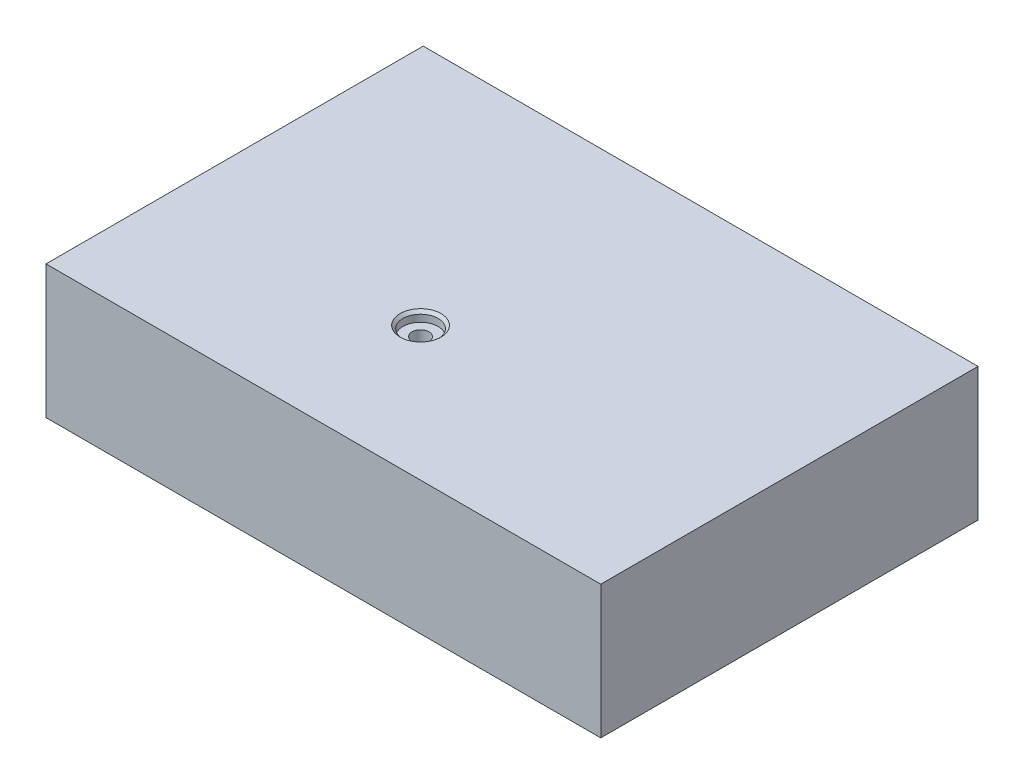
ISO-10303-21;
HEADER;
FILE_DESCRIPTION(('STEP AP214'),'2;1');
FILE_NAME('part.step','',(''),(''),'','','');
FILE_SCHEMA(('AUTOMOTIVE_DESIGN { 1 0 10303 214 1 1 1 1 }'));
ENDSEC;
DATA;
#1=APPLICATION_CONTEXT('core data for automotive mechanical design processes');
#2=APPLICATION_PROTOCOL_DEFINITION('international standard','automotive_design',2000,#1);
#3=PRODUCT_CONTEXT('',#1,'mechanical');
#4=PRODUCT('Part','Part','',(#3));
#5=PRODUCT_RELATED_PRODUCT_CATEGORY('part','',(#4));
#6=PRODUCT_DEFINITION_FORMATION('','',#4);
#7=PRODUCT_DEFINITION_CONTEXT('part definition',#1,'design');
#8=PRODUCT_DEFINITION('design','',#6,#7);
#9=PRODUCT_DEFINITION_SHAPE('','',#8);
#10=(LENGTH_UNIT() NAMED_UNIT(*) SI_UNIT(.MILLI.,.METRE.));
#11=(NAMED_UNIT(*) PLANE_ANGLE_UNIT() SI_UNIT($,.RADIAN.));
#12=(NAMED_UNIT(*) SI_UNIT($,.STERADIAN.) SOLID_ANGLE_UNIT());
#13=UNCERTAINTY_MEASURE_WITH_UNIT(LENGTH_MEASURE(1.E-05),#10,'distance_accuracy_value','');
#14=(GEOMETRIC_REPRESENTATION_CONTEXT(3) GLOBAL_UNCERTAINTY_ASSIGNED_CONTEXT((#13)) GLOBAL_UNIT_ASSIGNED_CONTEXT((#10,
#11,#12)) REPRESENTATION_CONTEXT('',''));
#15=CARTESIAN_POINT('',(0.,0.,0.));
#16=DIRECTION('',(0.,0.,1.));
#17=DIRECTION('',(1.,0.,0.));
#18=AXIS2_PLACEMENT_3D('',#15,#16,#17);
#19=CARTESIAN_POINT('',(-81.1067833265636,30.,-38.9478433654258));
#20=DIRECTION('',(1.,0.,0.));
#21=DIRECTION('',(0.,0.,-1.));
#22=AXIS2_PLACEMENT_3D('',#19,#20,#21);
#23=PLANE('',#22);
#24=DIRECTION('',(0.,0.,1.));
#25=VECTOR('',#24,1.);
#26=CARTESIAN_POINT('',(-81.1067833265636,0.,-38.9478433654258));
#27=LINE('',#26,#25);
#28=CARTESIAN_POINT('',(-81.1067833265636,0.,-38.9478433654258));
#29=VERTEX_POINT('',#28);
#30=CARTESIAN_POINT('',(-81.1067833265636,0.,46.0521566345742));
#31=VERTEX_POINT('',#30);
#32=EDGE_CURVE('E101',#29,#31,#27,.T.);
#33=ORIENTED_EDGE('',*,*,#32,.T.);
#34=DIRECTION('',(0.,-1.,0.));
#35=VECTOR('',#34,1.);
#36=CARTESIAN_POINT('',(-81.1067833265636,30.,46.0521566345742));
#37=LINE('',#36,#35);
#38=CARTESIAN_POINT('',(-81.1067833265636,30.,46.0521566345742));
#39=VERTEX_POINT('',#38);
#40=EDGE_CURVE('E11',#39,#31,#37,.T.);
#41=ORIENTED_EDGE('',*,*,#40,.F.);
#42=DIRECTION('',(0.,0.,1.));
#43=VECTOR('',#42,1.);
#44=CARTESIAN_POINT('',(-81.1067833265636,30.,-38.9478433654258));
#45=LINE('',#44,#43);
#46=CARTESIAN_POINT('',(-81.1067833265636,30.,-38.9478433654258));
#47=VERTEX_POINT('',#46);
#48=EDGE_CURVE('E89',#47,#39,#45,.T.);
#49=ORIENTED_EDGE('',*,*,#48,.F.);
#50=DIRECTION('',(0.,-1.,0.));
#51=VECTOR('',#50,1.);
#52=CARTESIAN_POINT('',(-81.1067833265636,30.,-38.9478433654258));
#53=LINE('',#52,#51);
#54=EDGE_CURVE('E97',#47,#29,#53,.T.);
#55=ORIENTED_EDGE('',*,*,#54,.T.);
#56=EDGE_LOOP('',(#33,#41,#49,#55));
#57=FACE_BOUND('',#56,.T.);
#58=ADVANCED_FACE('F38',(#57),#23,.F.);
#59=CARTESIAN_POINT('',(-81.1067833265636,30.,46.0521566345742));
#60=DIRECTION('',(0.,0.,-1.));
#61=DIRECTION('',(-1.,0.,0.));
#62=AXIS2_PLACEMENT_3D('',#59,#60,#61);
#63=PLANE('',#62);
#64=DIRECTION('',(1.,0.,0.));
#65=VECTOR('',#64,1.);
#66=CARTESIAN_POINT('',(-81.1067833265636,0.,46.0521566345742));
#67=LINE('',#66,#65);
#68=CARTESIAN_POINT('',(43.8932166734364,0.,46.0521566345742));
#69=VERTEX_POINT('',#68);
#70=EDGE_CURVE('E93',#31,#69,#67,.T.);
#71=ORIENTED_EDGE('',*,*,#70,.T.);
#72=DIRECTION('',(0.,-1.,0.));
#73=VECTOR('',#72,1.);
#74=CARTESIAN_POINT('',(43.8932166734364,30.,46.0521566345742));
#75=LINE('',#74,#73);
#76=CARTESIAN_POINT('',(43.8932166734364,30.,46.0521566345742));
#77=VERTEX_POINT('',#76);
#78=EDGE_CURVE('E46',#77,#69,#75,.T.);
#79=ORIENTED_EDGE('',*,*,#78,.F.);
#80=DIRECTION('',(1.,0.,0.));
#81=VECTOR('',#80,1.);
#82=CARTESIAN_POINT('',(-81.1067833265636,30.,46.0521566345742));
#83=LINE('',#82,#81);
#84=EDGE_CURVE('E84',#39,#77,#83,.T.);
#85=ORIENTED_EDGE('',*,*,#84,.F.);
#86=ORIENTED_EDGE('',*,*,#40,.T.);
#87=EDGE_LOOP('',(#71,#79,#85,#86));
#88=FACE_BOUND('',#87,.T.);
#89=ADVANCED_FACE('F92',(#88),#63,.F.);
#90=CARTESIAN_POINT('',(43.8932166734364,30.,-38.9478433654258));
#91=DIRECTION('',(-1.,0.,0.));
#92=DIRECTION('',(0.,0.,1.));
#93=AXIS2_PLACEMENT_3D('',#90,#91,#92);
#94=PLANE('',#93);
#95=DIRECTION('',(0.,0.,-1.));
#96=VECTOR('',#95,1.);
#97=CARTESIAN_POINT('',(43.8932166734364,0.,-38.9478433654258));
#98=LINE('',#97,#96);
#99=CARTESIAN_POINT('',(43.8932166734364,0.,-38.9478433654258));
#100=VERTEX_POINT('',#99);
#101=EDGE_CURVE('E71',#69,#100,#98,.T.);
#102=ORIENTED_EDGE('',*,*,#101,.T.);
#103=DIRECTION('',(0.,-1.,0.));
#104=VECTOR('',#103,1.);
#105=CARTESIAN_POINT('',(43.8932166734364,30.,-38.9478433654258));
#106=LINE('',#105,#104);
#107=CARTESIAN_POINT('',(43.8932166734364,30.,-38.9478433654258));
#108=VERTEX_POINT('',#107);
#109=EDGE_CURVE('E94',#108,#100,#106,.T.);
#110=ORIENTED_EDGE('',*,*,#109,.F.);
#111=DIRECTION('',(0.,0.,-1.));
#112=VECTOR('',#111,1.);
#113=CARTESIAN_POINT('',(43.8932166734364,30.,-38.9478433654258));
#114=LINE('',#113,#112);
#115=EDGE_CURVE('E87',#77,#108,#114,.T.);
#116=ORIENTED_EDGE('',*,*,#115,.F.);
#117=ORIENTED_EDGE('',*,*,#78,.T.);
#118=EDGE_LOOP('',(#102,#110,#116,#117));
#119=FACE_BOUND('',#118,.T.);
#120=ADVANCED_FACE('F95',(#119),#94,.F.);
#121=CARTESIAN_POINT('',(-81.1067833265636,30.,-38.9478433654258));
#122=DIRECTION('',(0.,0.,1.));
#123=DIRECTION('',(1.,0.,0.));
#124=AXIS2_PLACEMENT_3D('',#121,#122,#123);
#125=PLANE('',#124);
#126=DIRECTION('',(-1.,0.,0.));
#127=VECTOR('',#126,1.);
#128=CARTESIAN_POINT('',(-81.1067833265636,0.,-38.9478433654258));
#129=LINE('',#128,#127);
#130=EDGE_CURVE('E77',#100,#29,#129,.T.);
#131=ORIENTED_EDGE('',*,*,#130,.T.);
#132=ORIENTED_EDGE('',*,*,#54,.F.);
#133=DIRECTION('',(-1.,0.,0.));
#134=VECTOR('',#133,1.);
#135=CARTESIAN_POINT('',(-81.1067833265636,30.,-38.9478433654258));
#136=LINE('',#135,#134);
#137=EDGE_CURVE('E54',#108,#47,#136,.T.);
#138=ORIENTED_EDGE('',*,*,#137,.F.);
#139=ORIENTED_EDGE('',*,*,#109,.T.);
#140=EDGE_LOOP('',(#131,#132,#138,#139));
#141=FACE_BOUND('',#140,.T.);
#142=ADVANCED_FACE('F109',(#141),#125,.F.);
#143=CARTESIAN_POINT('',(0.,30.,0.));
#144=DIRECTION('',(0.,1.,0.));
#145=DIRECTION('',(0.,0.,1.));
#146=AXIS2_PLACEMENT_3D('',#143,#144,#145);
#147=PLANE('',#146);
#148=CARTESIAN_POINT('',(-26.9210371912436,30.,15.846157578892));
#149=DIRECTION('',(0.,1.,0.));
#150=DIRECTION('',(0.,0.,1.));
#151=AXIS2_PLACEMENT_3D('',#148,#149,#150);
#152=CIRCLE('',#151,4.60375);
#153=CARTESIAN_POINT('',(-26.9210371912436,30.,20.449907578892));
#154=VERTEX_POINT('',#153);
#155=EDGE_CURVE('E126',#154,#154,#152,.T.);
#156=ORIENTED_EDGE('',*,*,#155,.F.);
#157=EDGE_LOOP('',(#156));
#158=FACE_BOUND('',#157,.T.);
#159=ORIENTED_EDGE('',*,*,#48,.T.);
#160=ORIENTED_EDGE('',*,*,#84,.T.);
#161=ORIENTED_EDGE('',*,*,#115,.T.);
#162=ORIENTED_EDGE('',*,*,#137,.T.);
#163=EDGE_LOOP('',(#159,#160,#161,#162));
#164=FACE_BOUND('',#163,.T.);
#165=ADVANCED_FACE('F85',(#158,#164),#147,.T.);
#166=CARTESIAN_POINT('',(0.,0.,0.));
#167=DIRECTION('',(0.,1.,0.));
#168=DIRECTION('',(0.,0.,1.));
#169=AXIS2_PLACEMENT_3D('',#166,#167,#168);
#170=PLANE('',#169);
#171=CARTESIAN_POINT('',(-26.9210371912436,0.,15.846157578892));
#172=DIRECTION('',(0.,1.,0.));
#173=DIRECTION('',(0.,0.,1.));
#174=AXIS2_PLACEMENT_3D('',#171,#172,#173);
#175=CIRCLE('',#174,1.89864999999999);
#176=CARTESIAN_POINT('',(-26.9210371912436,0.,17.744807578892));
#177=VERTEX_POINT('',#176);
#178=EDGE_CURVE('E104',#177,#177,#175,.T.);
#179=ORIENTED_EDGE('',*,*,#178,.T.);
#180=EDGE_LOOP('',(#179));
#181=FACE_BOUND('',#180,.T.);
#182=ORIENTED_EDGE('',*,*,#32,.F.);
#183=ORIENTED_EDGE('',*,*,#130,.F.);
#184=ORIENTED_EDGE('',*,*,#101,.F.);
#185=ORIENTED_EDGE('',*,*,#70,.F.);
#186=EDGE_LOOP('',(#182,#183,#184,#185));
#187=FACE_BOUND('',#186,.T.);
#188=ADVANCED_FACE('F112',(#181,#187),#170,.F.);
#189=CARTESIAN_POINT('',(-26.9210371912436,30.,15.846157578892));
#190=DIRECTION('',(0.,1.,0.));
#191=DIRECTION('',(0.,0.,1.));
#192=AXIS2_PLACEMENT_3D('',#189,#190,#191);
#193=CYLINDRICAL_SURFACE('',#192,1.89864999999999);
#194=ORIENTED_EDGE('',*,*,#178,.F.);
#195=EDGE_LOOP('',(#194));
#196=FACE_BOUND('',#195,.T.);
#197=CARTESIAN_POINT('',(-26.9210371912436,27.7902,15.846157578892));
#198=DIRECTION('',(0.,1.,0.));
#199=DIRECTION('',(0.,0.,1.));
#200=AXIS2_PLACEMENT_3D('',#197,#198,#199);
#201=CIRCLE('',#200,1.89865);
#202=CARTESIAN_POINT('',(-26.9210371912436,27.7902,17.744807578892));
#203=VERTEX_POINT('',#202);
#204=EDGE_CURVE('E117',#203,#203,#201,.T.);
#205=ORIENTED_EDGE('',*,*,#204,.T.);
#206=EDGE_LOOP('',(#205));
#207=FACE_BOUND('',#206,.T.);
#208=ADVANCED_FACE('F138',(#196,#207),#193,.F.);
#209=CARTESIAN_POINT('',(-22.9522871912436,27.7902,15.846157578892));
#210=DIRECTION('',(0.,-1.,0.));
#211=DIRECTION('',(0.,0.,-1.));
#212=AXIS2_PLACEMENT_3D('',#209,#210,#211);
#213=PLANE('',#212);
#214=ORIENTED_EDGE('',*,*,#204,.F.);
#215=EDGE_LOOP('',(#214));
#216=FACE_BOUND('',#215,.T.);
#217=CARTESIAN_POINT('',(-26.9210371912436,27.7902,15.846157578892));
#218=DIRECTION('',(0.,1.,0.));
#219=DIRECTION('',(0.,0.,1.));
#220=AXIS2_PLACEMENT_3D('',#217,#218,#219);
#221=CIRCLE('',#220,3.96875);
#222=CARTESIAN_POINT('',(-26.9210371912436,27.7902,19.814907578892));
#223=VERTEX_POINT('',#222);
#224=EDGE_CURVE('E120',#223,#223,#221,.T.);
#225=ORIENTED_EDGE('',*,*,#224,.T.);
#226=EDGE_LOOP('',(#225));
#227=FACE_BOUND('',#226,.T.);
#228=ADVANCED_FACE('F176',(#216,#227),#213,.F.);
#229=CARTESIAN_POINT('',(-26.9210371912436,30.,15.846157578892));
#230=DIRECTION('',(0.,1.,0.));
#231=DIRECTION('',(0.,0.,1.));
#232=AXIS2_PLACEMENT_3D('',#229,#230,#231);
#233=CYLINDRICAL_SURFACE('',#232,3.96875);
#234=ORIENTED_EDGE('',*,*,#224,.F.);
#235=EDGE_LOOP('',(#234));
#236=FACE_BOUND('',#235,.T.);
#237=CARTESIAN_POINT('',(-26.9210371912436,29.365,15.846157578892));
#238=DIRECTION('',(0.,1.,0.));
#239=DIRECTION('',(0.,0.,1.));
#240=AXIS2_PLACEMENT_3D('',#237,#238,#239);
#241=CIRCLE('',#240,3.96875);
#242=CARTESIAN_POINT('',(-26.9210371912436,29.365,19.814907578892));
#243=VERTEX_POINT('',#242);
#244=EDGE_CURVE('E123',#243,#243,#241,.T.);
#245=ORIENTED_EDGE('',*,*,#244,.T.);
#246=EDGE_LOOP('',(#245));
#247=FACE_BOUND('',#246,.T.);
#248=ADVANCED_FACE('F185',(#236,#247),#233,.F.);
#249=CARTESIAN_POINT('',(-26.9210371912436,30.,15.846157578892));
#250=DIRECTION('',(0.,1.,0.));
#251=DIRECTION('',(0.,0.,1.));
#252=AXIS2_PLACEMENT_3D('',#249,#250,#251);
#253=CONICAL_SURFACE('',#252,4.60375,0.785398163397446);
#254=ORIENTED_EDGE('',*,*,#244,.F.);
#255=EDGE_LOOP('',(#254));
#256=FACE_BOUND('',#255,.T.);
#257=ORIENTED_EDGE('',*,*,#155,.T.);
#258=EDGE_LOOP('',(#257));
#259=FACE_BOUND('',#258,.T.);
#260=ADVANCED_FACE('F130',(#256,#259),#253,.F.);
#261=CLOSED_SHELL('',(#58,#89,#120,#142,#165,#188,#208,#228,#248,#260));
#262=MANIFOLD_SOLID_BREP('B2',#261);
#263=ADVANCED_BREP_SHAPE_REPRESENTATION('',(#18,#262),#14);
#264=SHAPE_DEFINITION_REPRESENTATION(#9,#263);
ENDSEC;
END-ISO-10303-21;
